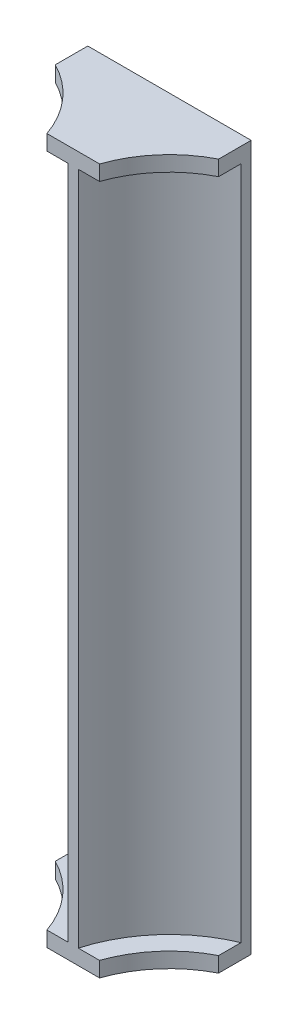
ISO-10303-21;
HEADER;
FILE_DESCRIPTION(('STEP AP214'),'2;1');
FILE_NAME('part.step','',(''),(''),'','','');
FILE_SCHEMA(('AUTOMOTIVE_DESIGN { 1 0 10303 214 1 1 1 1 }'));
ENDSEC;
DATA;
#1=APPLICATION_CONTEXT('core data for automotive mechanical design processes');
#2=APPLICATION_PROTOCOL_DEFINITION('international standard','automotive_design',2000,#1);
#3=PRODUCT_CONTEXT('',#1,'mechanical');
#4=PRODUCT('Part','Part','',(#3));
#5=PRODUCT_RELATED_PRODUCT_CATEGORY('part','',(#4));
#6=PRODUCT_DEFINITION_FORMATION('','',#4);
#7=PRODUCT_DEFINITION_CONTEXT('part definition',#1,'design');
#8=PRODUCT_DEFINITION('design','',#6,#7);
#9=PRODUCT_DEFINITION_SHAPE('','',#8);
#10=(LENGTH_UNIT() NAMED_UNIT(*) SI_UNIT(.MILLI.,.METRE.));
#11=(NAMED_UNIT(*) PLANE_ANGLE_UNIT() SI_UNIT($,.RADIAN.));
#12=(NAMED_UNIT(*) SI_UNIT($,.STERADIAN.) SOLID_ANGLE_UNIT());
#13=UNCERTAINTY_MEASURE_WITH_UNIT(LENGTH_MEASURE(1.E-05),#10,'distance_accuracy_value','');
#14=(GEOMETRIC_REPRESENTATION_CONTEXT(3) GLOBAL_UNCERTAINTY_ASSIGNED_CONTEXT((#13)) GLOBAL_UNIT_ASSIGNED_CONTEXT((#10,
#11,#12)) REPRESENTATION_CONTEXT('',''));
#15=CARTESIAN_POINT('',(0.,0.,0.));
#16=DIRECTION('',(0.,0.,1.));
#17=DIRECTION('',(1.,0.,0.));
#18=AXIS2_PLACEMENT_3D('',#15,#16,#17);
#19=CARTESIAN_POINT('',(0.,66.4,0.));
#20=DIRECTION('',(0.,-1.,0.));
#21=DIRECTION('',(0.,0.,-1.));
#22=AXIS2_PLACEMENT_3D('',#19,#20,#21);
#23=CYLINDRICAL_SURFACE('',#22,13.05);
#24=CARTESIAN_POINT('',(0.,0.,0.));
#25=DIRECTION('',(0.,-1.,0.));
#26=DIRECTION('',(0.,0.,1.));
#27=AXIS2_PLACEMENT_3D('',#24,#25,#26);
#28=CIRCLE('',#27,13.05);
#29=CARTESIAN_POINT('',(5.00999001995014,0.,-12.05));
#30=VERTEX_POINT('',#29);
#31=CARTESIAN_POINT('',(12.55,0.,-3.57770876399966));
#32=VERTEX_POINT('',#31);
#33=EDGE_CURVE('E226',#30,#32,#28,.T.);
#34=ORIENTED_EDGE('',*,*,#33,.T.);
#35=DIRECTION('',(0.,-1.,0.));
#36=VECTOR('',#35,1.);
#37=CARTESIAN_POINT('',(12.55,66.4,-3.57770876399966));
#38=LINE('',#37,#36);
#39=CARTESIAN_POINT('',(12.55,66.4,-3.57770876399966));
#40=VERTEX_POINT('',#39);
#41=EDGE_CURVE('E11',#40,#32,#38,.T.);
#42=ORIENTED_EDGE('',*,*,#41,.F.);
#43=CARTESIAN_POINT('',(0.,66.4,0.));
#44=DIRECTION('',(0.,-1.,0.));
#45=DIRECTION('',(0.,0.,1.));
#46=AXIS2_PLACEMENT_3D('',#43,#44,#45);
#47=CIRCLE('',#46,13.05);
#48=CARTESIAN_POINT('',(5.00999001995014,66.4,-12.05));
#49=VERTEX_POINT('',#48);
#50=EDGE_CURVE('E227',#49,#40,#47,.T.);
#51=ORIENTED_EDGE('',*,*,#50,.F.);
#52=DIRECTION('',(0.,-1.,0.));
#53=VECTOR('',#52,1.);
#54=CARTESIAN_POINT('',(5.00999001995014,66.4,-12.05));
#55=LINE('',#54,#53);
#56=EDGE_CURVE('E52',#49,#30,#55,.T.);
#57=ORIENTED_EDGE('',*,*,#56,.T.);
#58=EDGE_LOOP('',(#34,#42,#51,#57));
#59=FACE_BOUND('',#58,.T.);
#60=ADVANCED_FACE('F37',(#59),#23,.F.);
#61=CARTESIAN_POINT('',(12.55,66.4,-3.57770876399966));
#62=DIRECTION('',(0.,0.,-1.));
#63=DIRECTION('',(-1.,0.,0.));
#64=AXIS2_PLACEMENT_3D('',#61,#62,#63);
#65=PLANE('',#64);
#66=ORIENTED_EDGE('',*,*,#41,.T.);
#67=DIRECTION('',(1.,0.,0.));
#68=VECTOR('',#67,1.);
#69=CARTESIAN_POINT('',(0.,0.,-3.57770876399966));
#70=LINE('',#69,#68);
#71=CARTESIAN_POINT('',(10.4547835941257,0.,-3.57770876399966));
#72=VERTEX_POINT('',#71);
#73=EDGE_CURVE('E159',#72,#32,#70,.T.);
#74=ORIENTED_EDGE('',*,*,#73,.F.);
#75=DIRECTION('',(0.,1.,0.));
#76=VECTOR('',#75,1.);
#77=CARTESIAN_POINT('',(10.4547835941257,-1.5,-3.57770876399966));
#78=LINE('',#77,#76);
#79=CARTESIAN_POINT('',(10.4547835941257,-1.5,-3.57770876399966));
#80=VERTEX_POINT('',#79);
#81=EDGE_CURVE('E171',#80,#72,#78,.T.);
#82=ORIENTED_EDGE('',*,*,#81,.F.);
#83=DIRECTION('',(1.,0.,0.));
#84=VECTOR('',#83,1.);
#85=CARTESIAN_POINT('',(0.,-1.5,-3.57770876399966));
#86=LINE('',#85,#84);
#87=CARTESIAN_POINT('',(15.6452164058743,-1.5,-3.57770876399966));
#88=VERTEX_POINT('',#87);
#89=EDGE_CURVE('E158',#80,#88,#86,.T.);
#90=ORIENTED_EDGE('',*,*,#89,.T.);
#91=DIRECTION('',(0.,1.,0.));
#92=VECTOR('',#91,1.);
#93=CARTESIAN_POINT('',(15.6452164058743,-1.5,-3.57770876399966));
#94=LINE('',#93,#92);
#95=CARTESIAN_POINT('',(15.6452164058743,0.,-3.57770876399966));
#96=VERTEX_POINT('',#95);
#97=EDGE_CURVE('E181',#88,#96,#94,.T.);
#98=ORIENTED_EDGE('',*,*,#97,.T.);
#99=CARTESIAN_POINT('',(13.55,0.,-3.57770876399966));
#100=VERTEX_POINT('',#99);
#101=EDGE_CURVE('E161',#100,#96,#70,.T.);
#102=ORIENTED_EDGE('',*,*,#101,.F.);
#103=DIRECTION('',(0.,-1.,0.));
#104=VECTOR('',#103,1.);
#105=CARTESIAN_POINT('',(13.55,66.4,-3.57770876399966));
#106=LINE('',#105,#104);
#107=CARTESIAN_POINT('',(13.55,66.4,-3.57770876399966));
#108=VERTEX_POINT('',#107);
#109=EDGE_CURVE('E45',#108,#100,#106,.T.);
#110=ORIENTED_EDGE('',*,*,#109,.F.);
#111=DIRECTION('',(1.,0.,0.));
#112=VECTOR('',#111,1.);
#113=CARTESIAN_POINT('',(10.4547835941257,66.4,-3.57770876399966));
#114=LINE('',#113,#112);
#115=CARTESIAN_POINT('',(15.6452164058743,66.4,-3.57770876399966));
#116=VERTEX_POINT('',#115);
#117=EDGE_CURVE('E205',#108,#116,#114,.T.);
#118=ORIENTED_EDGE('',*,*,#117,.T.);
#119=DIRECTION('',(0.,-1.,0.));
#120=VECTOR('',#119,1.);
#121=CARTESIAN_POINT('',(15.6452164058743,67.9,-3.57770876399966));
#122=LINE('',#121,#120);
#123=CARTESIAN_POINT('',(15.6452164058743,67.9,-3.57770876399966));
#124=VERTEX_POINT('',#123);
#125=EDGE_CURVE('E220',#124,#116,#122,.T.);
#126=ORIENTED_EDGE('',*,*,#125,.F.);
#127=DIRECTION('',(1.,0.,0.));
#128=VECTOR('',#127,1.);
#129=CARTESIAN_POINT('',(10.4547835941257,67.9,-3.57770876399966));
#130=LINE('',#129,#128);
#131=CARTESIAN_POINT('',(10.4547835941257,67.9,-3.57770876399966));
#132=VERTEX_POINT('',#131);
#133=EDGE_CURVE('E189',#132,#124,#130,.T.);
#134=ORIENTED_EDGE('',*,*,#133,.F.);
#135=DIRECTION('',(0.,-1.,0.));
#136=VECTOR('',#135,1.);
#137=CARTESIAN_POINT('',(10.4547835941257,67.9,-3.57770876399966));
#138=LINE('',#137,#136);
#139=CARTESIAN_POINT('',(10.4547835941257,66.4,-3.57770876399966));
#140=VERTEX_POINT('',#139);
#141=EDGE_CURVE('E223',#132,#140,#138,.T.);
#142=ORIENTED_EDGE('',*,*,#141,.T.);
#143=EDGE_CURVE('E206',#140,#40,#114,.T.);
#144=ORIENTED_EDGE('',*,*,#143,.T.);
#145=EDGE_LOOP('',(#66,#74,#82,#90,#98,#102,#110,#118,#126,#134,#142,#144));
#146=FACE_BOUND('',#145,.T.);
#147=ADVANCED_FACE('F251',(#146),#65,.F.);
#148=CARTESIAN_POINT('',(26.1,66.4,0.));
#149=DIRECTION('',(0.,-1.,0.));
#150=DIRECTION('',(0.,0.,-1.));
#151=AXIS2_PLACEMENT_3D('',#148,#149,#150);
#152=CYLINDRICAL_SURFACE('',#151,13.05);
#153=CARTESIAN_POINT('',(26.1,0.,0.));
#154=DIRECTION('',(0.,-1.,0.));
#155=DIRECTION('',(0.,0.,1.));
#156=AXIS2_PLACEMENT_3D('',#153,#154,#155);
#157=CIRCLE('',#156,13.05);
#158=CARTESIAN_POINT('',(21.0900099800499,0.,-12.05));
#159=VERTEX_POINT('',#158);
#160=EDGE_CURVE('E231',#100,#159,#157,.T.);
#161=ORIENTED_EDGE('',*,*,#160,.T.);
#162=DIRECTION('',(0.,-1.,0.));
#163=VECTOR('',#162,1.);
#164=CARTESIAN_POINT('',(21.0900099800499,66.4,-12.05));
#165=LINE('',#164,#163);
#166=CARTESIAN_POINT('',(21.0900099800499,66.4,-12.05));
#167=VERTEX_POINT('',#166);
#168=EDGE_CURVE('E242',#167,#159,#165,.T.);
#169=ORIENTED_EDGE('',*,*,#168,.F.);
#170=CARTESIAN_POINT('',(26.1,66.4,0.));
#171=DIRECTION('',(0.,-1.,0.));
#172=DIRECTION('',(0.,0.,1.));
#173=AXIS2_PLACEMENT_3D('',#170,#171,#172);
#174=CIRCLE('',#173,13.05);
#175=EDGE_CURVE('E230',#108,#167,#174,.T.);
#176=ORIENTED_EDGE('',*,*,#175,.F.);
#177=ORIENTED_EDGE('',*,*,#109,.T.);
#178=EDGE_LOOP('',(#161,#169,#176,#177));
#179=FACE_BOUND('',#178,.T.);
#180=ADVANCED_FACE('F247',(#179),#152,.F.);
#181=CARTESIAN_POINT('',(21.0900099800499,66.4,-12.05));
#182=DIRECTION('',(-1.,0.,0.));
#183=DIRECTION('',(0.,0.,1.));
#184=AXIS2_PLACEMENT_3D('',#181,#182,#183);
#185=PLANE('',#184);
#186=ORIENTED_EDGE('',*,*,#168,.T.);
#187=DIRECTION('',(0.,0.,1.));
#188=VECTOR('',#187,1.);
#189=CARTESIAN_POINT('',(21.0900099800499,0.,0.));
#190=LINE('',#189,#188);
#191=CARTESIAN_POINT('',(21.0900099800499,0.,-9.84898471924899));
#192=VERTEX_POINT('',#191);
#193=EDGE_CURVE('E175',#159,#192,#190,.T.);
#194=ORIENTED_EDGE('',*,*,#193,.T.);
#195=DIRECTION('',(0.,1.,0.));
#196=VECTOR('',#195,1.);
#197=CARTESIAN_POINT('',(21.0900099800499,-1.5,-9.84898471924899));
#198=LINE('',#197,#196);
#199=CARTESIAN_POINT('',(21.0900099800499,-1.5,-9.84898471924899));
#200=VERTEX_POINT('',#199);
#201=EDGE_CURVE('E143',#200,#192,#198,.T.);
#202=ORIENTED_EDGE('',*,*,#201,.F.);
#203=DIRECTION('',(0.,0.,1.));
#204=VECTOR('',#203,1.);
#205=CARTESIAN_POINT('',(21.0900099800499,-1.5,0.));
#206=LINE('',#205,#204);
#207=CARTESIAN_POINT('',(21.0900099800499,-1.5,-13.05));
#208=VERTEX_POINT('',#207);
#209=EDGE_CURVE('E165',#208,#200,#206,.T.);
#210=ORIENTED_EDGE('',*,*,#209,.F.);
#211=DIRECTION('',(0.,-1.,0.));
#212=VECTOR('',#211,1.);
#213=CARTESIAN_POINT('',(21.0900099800499,66.4,-13.05));
#214=LINE('',#213,#212);
#215=CARTESIAN_POINT('',(21.0900099800499,67.9,-13.05));
#216=VERTEX_POINT('',#215);
#217=EDGE_CURVE('E240',#216,#208,#214,.T.);
#218=ORIENTED_EDGE('',*,*,#217,.F.);
#219=DIRECTION('',(0.,0.,-1.));
#220=VECTOR('',#219,1.);
#221=CARTESIAN_POINT('',(21.0900099800499,67.9,-9.84898471924899));
#222=LINE('',#221,#220);
#223=CARTESIAN_POINT('',(21.0900099800499,67.9,-9.84898471924899));
#224=VERTEX_POINT('',#223);
#225=EDGE_CURVE('E194',#224,#216,#222,.T.);
#226=ORIENTED_EDGE('',*,*,#225,.F.);
#227=DIRECTION('',(0.,-1.,0.));
#228=VECTOR('',#227,1.);
#229=CARTESIAN_POINT('',(21.0900099800499,67.9,-9.84898471924899));
#230=LINE('',#229,#228);
#231=CARTESIAN_POINT('',(21.0900099800499,66.4,-9.84898471924899));
#232=VERTEX_POINT('',#231);
#233=EDGE_CURVE('E217',#224,#232,#230,.T.);
#234=ORIENTED_EDGE('',*,*,#233,.T.);
#235=DIRECTION('',(0.,0.,-1.));
#236=VECTOR('',#235,1.);
#237=CARTESIAN_POINT('',(21.0900099800499,66.4,-9.84898471924899));
#238=LINE('',#237,#236);
#239=EDGE_CURVE('E211',#232,#167,#238,.T.);
#240=ORIENTED_EDGE('',*,*,#239,.T.);
#241=EDGE_LOOP('',(#186,#194,#202,#210,#218,#226,#234,#240));
#242=FACE_BOUND('',#241,.T.);
#243=ADVANCED_FACE('F259',(#242),#185,.F.);
#244=CARTESIAN_POINT('',(5.00999001995014,66.4,-13.05));
#245=DIRECTION('',(0.,0.,1.));
#246=DIRECTION('',(1.,0.,0.));
#247=AXIS2_PLACEMENT_3D('',#244,#245,#246);
#248=PLANE('',#247);
#249=ORIENTED_EDGE('',*,*,#217,.T.);
#250=DIRECTION('',(1.,0.,0.));
#251=VECTOR('',#250,1.);
#252=CARTESIAN_POINT('',(0.,-1.5,-13.05));
#253=LINE('',#252,#251);
#254=CARTESIAN_POINT('',(5.00999001995014,-1.5,-13.05));
#255=VERTEX_POINT('',#254);
#256=EDGE_CURVE('E153',#255,#208,#253,.T.);
#257=ORIENTED_EDGE('',*,*,#256,.F.);
#258=DIRECTION('',(0.,-1.,0.));
#259=VECTOR('',#258,1.);
#260=CARTESIAN_POINT('',(5.00999001995014,66.4,-13.05));
#261=LINE('',#260,#259);
#262=CARTESIAN_POINT('',(5.00999001995014,67.9,-13.05));
#263=VERTEX_POINT('',#262);
#264=EDGE_CURVE('E149',#263,#255,#261,.T.);
#265=ORIENTED_EDGE('',*,*,#264,.F.);
#266=DIRECTION('',(-1.,0.,0.));
#267=VECTOR('',#266,1.);
#268=CARTESIAN_POINT('',(21.0900099800499,67.9,-13.05));
#269=LINE('',#268,#267);
#270=EDGE_CURVE('E197',#216,#263,#269,.T.);
#271=ORIENTED_EDGE('',*,*,#270,.F.);
#272=EDGE_LOOP('',(#249,#257,#265,#271));
#273=FACE_BOUND('',#272,.T.);
#274=ADVANCED_FACE('F281',(#273),#248,.F.);
#275=CARTESIAN_POINT('',(5.00999001995014,66.4,-12.05));
#276=DIRECTION('',(1.,0.,0.));
#277=DIRECTION('',(0.,0.,-1.));
#278=AXIS2_PLACEMENT_3D('',#275,#276,#277);
#279=PLANE('',#278);
#280=ORIENTED_EDGE('',*,*,#264,.T.);
#281=DIRECTION('',(0.,0.,-1.));
#282=VECTOR('',#281,1.);
#283=CARTESIAN_POINT('',(5.00999001995014,-1.5,0.));
#284=LINE('',#283,#282);
#285=CARTESIAN_POINT('',(5.00999001995014,-1.5,-9.84898471924899));
#286=VERTEX_POINT('',#285);
#287=EDGE_CURVE('E146',#286,#255,#284,.T.);
#288=ORIENTED_EDGE('',*,*,#287,.F.);
#289=DIRECTION('',(0.,1.,0.));
#290=VECTOR('',#289,1.);
#291=CARTESIAN_POINT('',(5.00999001995014,-1.5,-9.84898471924899));
#292=LINE('',#291,#290);
#293=CARTESIAN_POINT('',(5.00999001995014,0.,-9.84898471924899));
#294=VERTEX_POINT('',#293);
#295=EDGE_CURVE('E133',#286,#294,#292,.T.);
#296=ORIENTED_EDGE('',*,*,#295,.T.);
#297=DIRECTION('',(0.,0.,-1.));
#298=VECTOR('',#297,1.);
#299=CARTESIAN_POINT('',(5.00999001995014,0.,0.));
#300=LINE('',#299,#298);
#301=EDGE_CURVE('E173',#294,#30,#300,.T.);
#302=ORIENTED_EDGE('',*,*,#301,.T.);
#303=ORIENTED_EDGE('',*,*,#56,.F.);
#304=DIRECTION('',(0.,0.,1.));
#305=VECTOR('',#304,1.);
#306=CARTESIAN_POINT('',(5.00999001995014,66.4,-13.05));
#307=LINE('',#306,#305);
#308=CARTESIAN_POINT('',(5.00999001995014,66.4,-9.84898471924899));
#309=VERTEX_POINT('',#308);
#310=EDGE_CURVE('E190',#49,#309,#307,.T.);
#311=ORIENTED_EDGE('',*,*,#310,.T.);
#312=DIRECTION('',(0.,-1.,0.));
#313=VECTOR('',#312,1.);
#314=CARTESIAN_POINT('',(5.00999001995014,67.9,-9.84898471924899));
#315=LINE('',#314,#313);
#316=CARTESIAN_POINT('',(5.00999001995014,67.9,-9.84898471924899));
#317=VERTEX_POINT('',#316);
#318=EDGE_CURVE('E202',#317,#309,#315,.T.);
#319=ORIENTED_EDGE('',*,*,#318,.F.);
#320=DIRECTION('',(0.,0.,1.));
#321=VECTOR('',#320,1.);
#322=CARTESIAN_POINT('',(5.00999001995014,67.9,-13.05));
#323=LINE('',#322,#321);
#324=EDGE_CURVE('E200',#263,#317,#323,.T.);
#325=ORIENTED_EDGE('',*,*,#324,.F.);
#326=EDGE_LOOP('',(#280,#288,#296,#302,#303,#311,#319,#325));
#327=FACE_BOUND('',#326,.T.);
#328=ADVANCED_FACE('F147',(#327),#279,.F.);
#329=CARTESIAN_POINT('',(0.,66.4,0.));
#330=DIRECTION('',(0.,1.,0.));
#331=DIRECTION('',(0.,0.,1.));
#332=AXIS2_PLACEMENT_3D('',#329,#330,#331);
#333=PLANE('',#332);
#334=ORIENTED_EDGE('',*,*,#310,.F.);
#335=ORIENTED_EDGE('',*,*,#50,.T.);
#336=ORIENTED_EDGE('',*,*,#143,.F.);
#337=CARTESIAN_POINT('',(0.,66.4,0.));
#338=DIRECTION('',(0.,-1.,0.));
#339=DIRECTION('',(0.,0.,1.));
#340=AXIS2_PLACEMENT_3D('',#337,#338,#339);
#341=CIRCLE('',#340,11.05);
#342=EDGE_CURVE('E142',#309,#140,#341,.T.);
#343=ORIENTED_EDGE('',*,*,#342,.F.);
#344=EDGE_LOOP('',(#334,#335,#336,#343));
#345=FACE_BOUND('',#344,.T.);
#346=ADVANCED_FACE('F270',(#345),#333,.F.);
#347=ORIENTED_EDGE('',*,*,#117,.F.);
#348=ORIENTED_EDGE('',*,*,#175,.T.);
#349=ORIENTED_EDGE('',*,*,#239,.F.);
#350=CARTESIAN_POINT('',(26.1,66.4,0.));
#351=DIRECTION('',(0.,-1.,0.));
#352=DIRECTION('',(0.,0.,-1.));
#353=AXIS2_PLACEMENT_3D('',#350,#351,#352);
#354=CIRCLE('',#353,11.05);
#355=EDGE_CURVE('E209',#116,#232,#354,.T.);
#356=ORIENTED_EDGE('',*,*,#355,.F.);
#357=EDGE_LOOP('',(#347,#348,#349,#356));
#358=FACE_BOUND('',#357,.T.);
#359=ADVANCED_FACE('F288',(#358),#333,.F.);
#360=CARTESIAN_POINT('',(0.,67.9,0.));
#361=DIRECTION('',(0.,-1.,0.));
#362=DIRECTION('',(0.,0.,-1.));
#363=AXIS2_PLACEMENT_3D('',#360,#361,#362);
#364=CYLINDRICAL_SURFACE('',#363,11.05);
#365=ORIENTED_EDGE('',*,*,#342,.T.);
#366=ORIENTED_EDGE('',*,*,#141,.F.);
#367=CARTESIAN_POINT('',(0.,67.9,0.));
#368=DIRECTION('',(0.,-1.,0.));
#369=DIRECTION('',(0.,0.,1.));
#370=AXIS2_PLACEMENT_3D('',#367,#368,#369);
#371=CIRCLE('',#370,11.05);
#372=EDGE_CURVE('E186',#317,#132,#371,.T.);
#373=ORIENTED_EDGE('',*,*,#372,.F.);
#374=ORIENTED_EDGE('',*,*,#318,.T.);
#375=EDGE_LOOP('',(#365,#366,#373,#374));
#376=FACE_BOUND('',#375,.T.);
#377=ADVANCED_FACE('F274',(#376),#364,.F.);
#378=CARTESIAN_POINT('',(26.1,67.9,0.));
#379=DIRECTION('',(0.,-1.,0.));
#380=DIRECTION('',(0.,0.,-1.));
#381=AXIS2_PLACEMENT_3D('',#378,#379,#380);
#382=CYLINDRICAL_SURFACE('',#381,11.05);
#383=ORIENTED_EDGE('',*,*,#355,.T.);
#384=ORIENTED_EDGE('',*,*,#233,.F.);
#385=CARTESIAN_POINT('',(26.1,67.9,0.));
#386=DIRECTION('',(0.,-1.,0.));
#387=DIRECTION('',(0.,0.,-1.));
#388=AXIS2_PLACEMENT_3D('',#385,#386,#387);
#389=CIRCLE('',#388,11.05);
#390=EDGE_CURVE('E192',#124,#224,#389,.T.);
#391=ORIENTED_EDGE('',*,*,#390,.F.);
#392=ORIENTED_EDGE('',*,*,#125,.T.);
#393=EDGE_LOOP('',(#383,#384,#391,#392));
#394=FACE_BOUND('',#393,.T.);
#395=ADVANCED_FACE('F289',(#394),#382,.F.);
#396=CARTESIAN_POINT('',(0.,67.9,0.));
#397=DIRECTION('',(0.,1.,0.));
#398=DIRECTION('',(0.,0.,1.));
#399=AXIS2_PLACEMENT_3D('',#396,#397,#398);
#400=PLANE('',#399);
#401=ORIENTED_EDGE('',*,*,#372,.T.);
#402=ORIENTED_EDGE('',*,*,#133,.T.);
#403=ORIENTED_EDGE('',*,*,#390,.T.);
#404=ORIENTED_EDGE('',*,*,#225,.T.);
#405=ORIENTED_EDGE('',*,*,#270,.T.);
#406=ORIENTED_EDGE('',*,*,#324,.T.);
#407=EDGE_LOOP('',(#401,#402,#403,#404,#405,#406));
#408=FACE_BOUND('',#407,.T.);
#409=ADVANCED_FACE('F277',(#408),#400,.T.);
#410=CARTESIAN_POINT('',(0.,0.,0.));
#411=DIRECTION('',(0.,-1.,0.));
#412=DIRECTION('',(0.,0.,-1.));
#413=AXIS2_PLACEMENT_3D('',#410,#411,#412);
#414=PLANE('',#413);
#415=ORIENTED_EDGE('',*,*,#33,.F.);
#416=ORIENTED_EDGE('',*,*,#301,.F.);
#417=CARTESIAN_POINT('',(0.,0.,0.));
#418=DIRECTION('',(0.,-1.,0.));
#419=DIRECTION('',(0.,0.,-1.));
#420=AXIS2_PLACEMENT_3D('',#417,#418,#419);
#421=CIRCLE('',#420,11.05);
#422=EDGE_CURVE('E140',#294,#72,#421,.T.);
#423=ORIENTED_EDGE('',*,*,#422,.T.);
#424=ORIENTED_EDGE('',*,*,#73,.T.);
#425=EDGE_LOOP('',(#415,#416,#423,#424));
#426=FACE_BOUND('',#425,.T.);
#427=ADVANCED_FACE('F265',(#426),#414,.F.);
#428=ORIENTED_EDGE('',*,*,#160,.F.);
#429=ORIENTED_EDGE('',*,*,#101,.T.);
#430=CARTESIAN_POINT('',(26.1000000000001,0.,0.));
#431=DIRECTION('',(0.,-1.,0.));
#432=DIRECTION('',(0.,0.,-1.));
#433=AXIS2_PLACEMENT_3D('',#430,#431,#432);
#434=CIRCLE('',#433,11.0500000000001);
#435=EDGE_CURVE('E177',#96,#192,#434,.T.);
#436=ORIENTED_EDGE('',*,*,#435,.T.);
#437=ORIENTED_EDGE('',*,*,#193,.F.);
#438=EDGE_LOOP('',(#428,#429,#436,#437));
#439=FACE_BOUND('',#438,.T.);
#440=ADVANCED_FACE('F255',(#439),#414,.F.);
#441=CARTESIAN_POINT('',(0.,-1.5,0.));
#442=DIRECTION('',(0.,1.,0.));
#443=DIRECTION('',(0.,0.,1.));
#444=AXIS2_PLACEMENT_3D('',#441,#442,#443);
#445=CYLINDRICAL_SURFACE('',#444,11.05);
#446=ORIENTED_EDGE('',*,*,#422,.F.);
#447=ORIENTED_EDGE('',*,*,#295,.F.);
#448=CARTESIAN_POINT('',(0.,-1.5,0.));
#449=DIRECTION('',(0.,-1.,0.));
#450=DIRECTION('',(0.,0.,-1.));
#451=AXIS2_PLACEMENT_3D('',#448,#449,#450);
#452=CIRCLE('',#451,11.05);
#453=EDGE_CURVE('E137',#286,#80,#452,.T.);
#454=ORIENTED_EDGE('',*,*,#453,.T.);
#455=ORIENTED_EDGE('',*,*,#81,.T.);
#456=EDGE_LOOP('',(#446,#447,#454,#455));
#457=FACE_BOUND('',#456,.T.);
#458=ADVANCED_FACE('F135',(#457),#445,.F.);
#459=CARTESIAN_POINT('',(26.1000000000001,-1.5,0.));
#460=DIRECTION('',(0.,1.,0.));
#461=DIRECTION('',(0.,0.,1.));
#462=AXIS2_PLACEMENT_3D('',#459,#460,#461);
#463=CYLINDRICAL_SURFACE('',#462,11.0500000000001);
#464=ORIENTED_EDGE('',*,*,#435,.F.);
#465=ORIENTED_EDGE('',*,*,#97,.F.);
#466=CARTESIAN_POINT('',(26.1000000000001,-1.5,0.));
#467=DIRECTION('',(0.,-1.,0.));
#468=DIRECTION('',(0.,0.,-1.));
#469=AXIS2_PLACEMENT_3D('',#466,#467,#468);
#470=CIRCLE('',#469,11.0500000000001);
#471=EDGE_CURVE('E167',#88,#200,#470,.T.);
#472=ORIENTED_EDGE('',*,*,#471,.T.);
#473=ORIENTED_EDGE('',*,*,#201,.T.);
#474=EDGE_LOOP('',(#464,#465,#472,#473));
#475=FACE_BOUND('',#474,.T.);
#476=ADVANCED_FACE('F262',(#475),#463,.F.);
#477=CARTESIAN_POINT('',(0.,-1.5,0.));
#478=DIRECTION('',(0.,-1.,0.));
#479=DIRECTION('',(0.,0.,-1.));
#480=AXIS2_PLACEMENT_3D('',#477,#478,#479);
#481=PLANE('',#480);
#482=ORIENTED_EDGE('',*,*,#453,.F.);
#483=ORIENTED_EDGE('',*,*,#287,.T.);
#484=ORIENTED_EDGE('',*,*,#256,.T.);
#485=ORIENTED_EDGE('',*,*,#209,.T.);
#486=ORIENTED_EDGE('',*,*,#471,.F.);
#487=ORIENTED_EDGE('',*,*,#89,.F.);
#488=EDGE_LOOP('',(#482,#483,#484,#485,#486,#487));
#489=FACE_BOUND('',#488,.T.);
#490=ADVANCED_FACE('F155',(#489),#481,.T.);
#491=CLOSED_SHELL('',(#60,#147,#180,#243,#274,#328,#346,#359,#377,#395,#409,#427,#440,#458,#476,#490));
#492=MANIFOLD_SOLID_BREP('B2',#491);
#493=ADVANCED_BREP_SHAPE_REPRESENTATION('',(#18,#492),#14);
#494=SHAPE_DEFINITION_REPRESENTATION(#9,#493);
ENDSEC;
END-ISO-10303-21;
